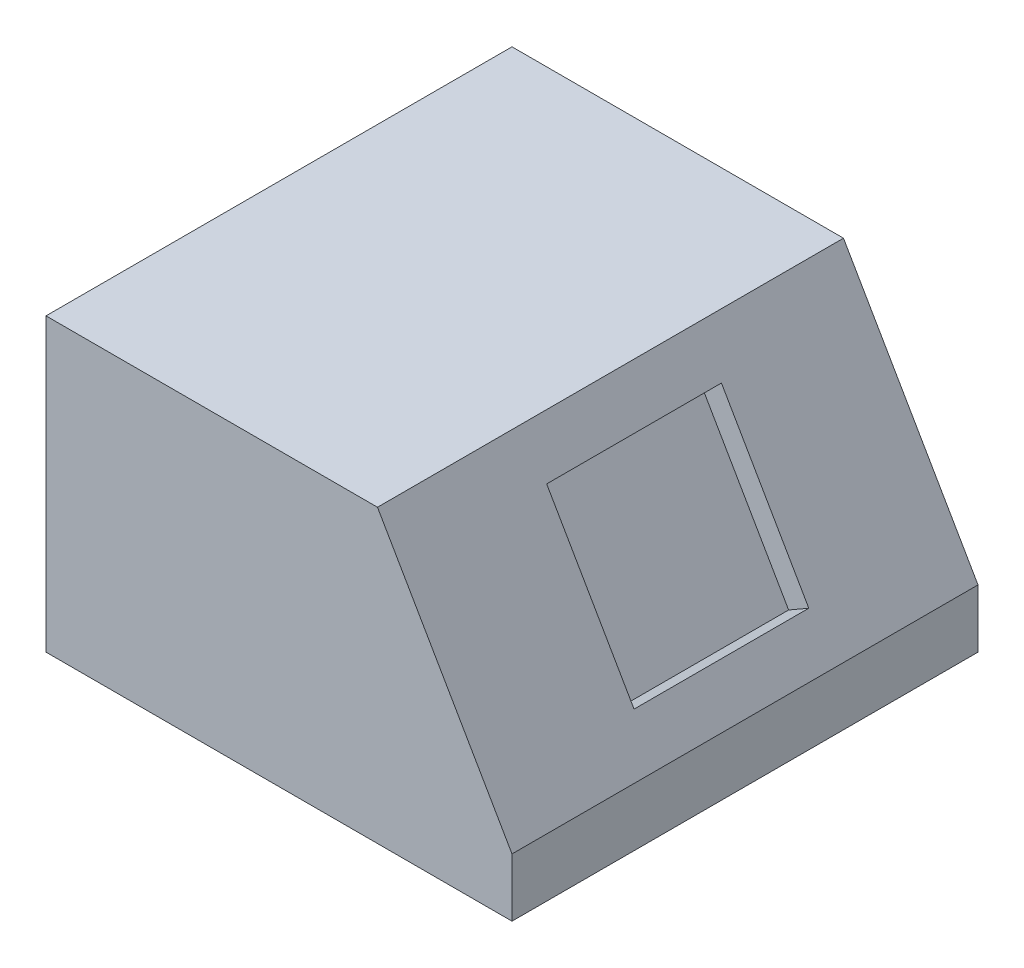
ISO-10303-21;
HEADER;
FILE_DESCRIPTION(('STEP AP214'),'2;1');
FILE_NAME('part.step','',(''),(''),'','','');
FILE_SCHEMA(('AUTOMOTIVE_DESIGN { 1 0 10303 214 1 1 1 1 }'));
ENDSEC;
DATA;
#1=APPLICATION_CONTEXT('core data for automotive mechanical design processes');
#2=APPLICATION_PROTOCOL_DEFINITION('international standard','automotive_design',2000,#1);
#3=PRODUCT_CONTEXT('',#1,'mechanical');
#4=PRODUCT('Part','Part','',(#3));
#5=PRODUCT_RELATED_PRODUCT_CATEGORY('part','',(#4));
#6=PRODUCT_DEFINITION_FORMATION('','',#4);
#7=PRODUCT_DEFINITION_CONTEXT('part definition',#1,'design');
#8=PRODUCT_DEFINITION('design','',#6,#7);
#9=PRODUCT_DEFINITION_SHAPE('','',#8);
#10=(LENGTH_UNIT() NAMED_UNIT(*) SI_UNIT(.MILLI.,.METRE.));
#11=(NAMED_UNIT(*) PLANE_ANGLE_UNIT() SI_UNIT($,.RADIAN.));
#12=(NAMED_UNIT(*) SI_UNIT($,.STERADIAN.) SOLID_ANGLE_UNIT());
#13=UNCERTAINTY_MEASURE_WITH_UNIT(LENGTH_MEASURE(1.E-05),#10,'distance_accuracy_value','');
#14=(GEOMETRIC_REPRESENTATION_CONTEXT(3) GLOBAL_UNCERTAINTY_ASSIGNED_CONTEXT((#13)) GLOBAL_UNIT_ASSIGNED_CONTEXT((#10,
#11,#12)) REPRESENTATION_CONTEXT('',''));
#15=CARTESIAN_POINT('',(0.,0.,0.));
#16=DIRECTION('',(0.,0.,1.));
#17=DIRECTION('',(1.,0.,0.));
#18=AXIS2_PLACEMENT_3D('',#15,#16,#17);
#19=CARTESIAN_POINT('',(-20.,25.,20.));
#20=DIRECTION('',(1.,0.,0.));
#21=DIRECTION('',(0.,0.,-1.));
#22=AXIS2_PLACEMENT_3D('',#19,#20,#21);
#23=PLANE('',#22);
#24=DIRECTION('',(0.,0.,1.));
#25=VECTOR('',#24,1.);
#26=CARTESIAN_POINT('',(-20.,0.,20.));
#27=LINE('',#26,#25);
#28=CARTESIAN_POINT('',(-20.,0.,-20.));
#29=VERTEX_POINT('',#28);
#30=CARTESIAN_POINT('',(-20.,0.,20.));
#31=VERTEX_POINT('',#30);
#32=EDGE_CURVE('E188',#29,#31,#27,.T.);
#33=ORIENTED_EDGE('',*,*,#32,.T.);
#34=DIRECTION('',(0.,-1.,0.));
#35=VECTOR('',#34,1.);
#36=CARTESIAN_POINT('',(-20.,25.,20.));
#37=LINE('',#36,#35);
#38=CARTESIAN_POINT('',(-20.,25.,20.));
#39=VERTEX_POINT('',#38);
#40=EDGE_CURVE('E232',#39,#31,#37,.T.);
#41=ORIENTED_EDGE('',*,*,#40,.F.);
#42=DIRECTION('',(0.,0.,1.));
#43=VECTOR('',#42,1.);
#44=CARTESIAN_POINT('',(-20.,25.,20.));
#45=LINE('',#44,#43);
#46=CARTESIAN_POINT('',(-20.,25.,-20.));
#47=VERTEX_POINT('',#46);
#48=EDGE_CURVE('E196',#47,#39,#45,.T.);
#49=ORIENTED_EDGE('',*,*,#48,.F.);
#50=DIRECTION('',(0.,-1.,0.));
#51=VECTOR('',#50,1.);
#52=CARTESIAN_POINT('',(-20.,25.,-20.));
#53=LINE('',#52,#51);
#54=EDGE_CURVE('E209',#47,#29,#53,.T.);
#55=ORIENTED_EDGE('',*,*,#54,.T.);
#56=EDGE_LOOP('',(#33,#41,#49,#55));
#57=FACE_BOUND('',#56,.T.);
#58=ADVANCED_FACE('F57',(#57),#23,.F.);
#59=CARTESIAN_POINT('',(20.,25.,20.));
#60=DIRECTION('',(0.,0.,-1.));
#61=DIRECTION('',(-1.,0.,0.));
#62=AXIS2_PLACEMENT_3D('',#59,#60,#61);
#63=PLANE('',#62);
#64=DIRECTION('',(0.,-1.,0.));
#65=VECTOR('',#64,1.);
#66=CARTESIAN_POINT('',(20.,25.,20.));
#67=LINE('',#66,#65);
#68=CARTESIAN_POINT('',(20.,4.99999999999988,20.));
#69=VERTEX_POINT('',#68);
#70=CARTESIAN_POINT('',(20.,0.,20.));
#71=VERTEX_POINT('',#70);
#72=EDGE_CURVE('E229',#69,#71,#67,.T.);
#73=ORIENTED_EDGE('',*,*,#72,.F.);
#74=DIRECTION('',(-0.499999999999998,0.86602540378444,0.));
#75=VECTOR('',#74,1.);
#76=CARTESIAN_POINT('',(8.45299461620747,25.,20.));
#77=LINE('',#76,#75);
#78=CARTESIAN_POINT('',(8.45299461620747,25.,20.));
#79=VERTEX_POINT('',#78);
#80=EDGE_CURVE('E12',#69,#79,#77,.T.);
#81=ORIENTED_EDGE('',*,*,#80,.T.);
#82=DIRECTION('',(1.,0.,0.));
#83=VECTOR('',#82,1.);
#84=CARTESIAN_POINT('',(20.,25.,20.));
#85=LINE('',#84,#83);
#86=EDGE_CURVE('E205',#39,#79,#85,.T.);
#87=ORIENTED_EDGE('',*,*,#86,.F.);
#88=ORIENTED_EDGE('',*,*,#40,.T.);
#89=DIRECTION('',(1.,0.,0.));
#90=VECTOR('',#89,1.);
#91=CARTESIAN_POINT('',(20.,0.,20.));
#92=LINE('',#91,#90);
#93=EDGE_CURVE('E212',#31,#71,#92,.T.);
#94=ORIENTED_EDGE('',*,*,#93,.T.);
#95=EDGE_LOOP('',(#73,#81,#87,#88,#94));
#96=FACE_BOUND('',#95,.T.);
#97=ADVANCED_FACE('F257',(#96),#63,.F.);
#98=CARTESIAN_POINT('',(20.,25.,20.));
#99=DIRECTION('',(-1.,0.,0.));
#100=DIRECTION('',(0.,0.,1.));
#101=AXIS2_PLACEMENT_3D('',#98,#99,#100);
#102=PLANE('',#101);
#103=DIRECTION('',(0.,-1.,0.));
#104=VECTOR('',#103,1.);
#105=CARTESIAN_POINT('',(20.,25.,-20.));
#106=LINE('',#105,#104);
#107=CARTESIAN_POINT('',(20.,4.99999999999988,-20.));
#108=VERTEX_POINT('',#107);
#109=CARTESIAN_POINT('',(20.,0.,-20.));
#110=VERTEX_POINT('',#109);
#111=EDGE_CURVE('E230',#108,#110,#106,.T.);
#112=ORIENTED_EDGE('',*,*,#111,.F.);
#113=DIRECTION('',(0.,0.,1.));
#114=VECTOR('',#113,1.);
#115=CARTESIAN_POINT('',(20.,4.99999999999988,20.));
#116=LINE('',#115,#114);
#117=EDGE_CURVE('E68',#108,#69,#116,.T.);
#118=ORIENTED_EDGE('',*,*,#117,.T.);
#119=ORIENTED_EDGE('',*,*,#72,.T.);
#120=DIRECTION('',(0.,0.,-1.));
#121=VECTOR('',#120,1.);
#122=CARTESIAN_POINT('',(20.,0.,20.));
#123=LINE('',#122,#121);
#124=EDGE_CURVE('E217',#71,#110,#123,.T.);
#125=ORIENTED_EDGE('',*,*,#124,.T.);
#126=EDGE_LOOP('',(#112,#118,#119,#125));
#127=FACE_BOUND('',#126,.T.);
#128=ADVANCED_FACE('F275',(#127),#102,.F.);
#129=CARTESIAN_POINT('',(20.,25.,-20.));
#130=DIRECTION('',(0.,0.,1.));
#131=DIRECTION('',(1.,0.,0.));
#132=AXIS2_PLACEMENT_3D('',#129,#130,#131);
#133=PLANE('',#132);
#134=DIRECTION('',(-1.,0.,0.));
#135=VECTOR('',#134,1.);
#136=CARTESIAN_POINT('',(20.,25.,-20.));
#137=LINE('',#136,#135);
#138=CARTESIAN_POINT('',(8.45299461620747,25.,-20.));
#139=VERTEX_POINT('',#138);
#140=EDGE_CURVE('E210',#139,#47,#137,.T.);
#141=ORIENTED_EDGE('',*,*,#140,.F.);
#142=DIRECTION('',(0.499999999999998,-0.86602540378444,0.));
#143=VECTOR('',#142,1.);
#144=CARTESIAN_POINT('',(8.45299461620747,25.,-20.));
#145=LINE('',#144,#143);
#146=EDGE_CURVE('E241',#139,#108,#145,.T.);
#147=ORIENTED_EDGE('',*,*,#146,.T.);
#148=ORIENTED_EDGE('',*,*,#111,.T.);
#149=DIRECTION('',(-1.,0.,0.));
#150=VECTOR('',#149,1.);
#151=CARTESIAN_POINT('',(20.,0.,-20.));
#152=LINE('',#151,#150);
#153=EDGE_CURVE('E201',#110,#29,#152,.T.);
#154=ORIENTED_EDGE('',*,*,#153,.T.);
#155=ORIENTED_EDGE('',*,*,#54,.F.);
#156=EDGE_LOOP('',(#141,#147,#148,#154,#155));
#157=FACE_BOUND('',#156,.T.);
#158=ADVANCED_FACE('F273',(#157),#133,.F.);
#159=CARTESIAN_POINT('',(0.,25.,0.));
#160=DIRECTION('',(0.,1.,0.));
#161=DIRECTION('',(0.,0.,1.));
#162=AXIS2_PLACEMENT_3D('',#159,#160,#161);
#163=PLANE('',#162);
#164=ORIENTED_EDGE('',*,*,#86,.T.);
#165=DIRECTION('',(0.,0.,-1.));
#166=VECTOR('',#165,1.);
#167=CARTESIAN_POINT('',(8.45299461620747,25.,-20.));
#168=LINE('',#167,#166);
#169=EDGE_CURVE('E240',#79,#139,#168,.T.);
#170=ORIENTED_EDGE('',*,*,#169,.T.);
#171=ORIENTED_EDGE('',*,*,#140,.T.);
#172=ORIENTED_EDGE('',*,*,#48,.T.);
#173=EDGE_LOOP('',(#164,#170,#171,#172));
#174=FACE_BOUND('',#173,.T.);
#175=ADVANCED_FACE('F265',(#174),#163,.T.);
#176=CARTESIAN_POINT('',(0.,0.,0.));
#177=DIRECTION('',(0.,1.,0.));
#178=DIRECTION('',(0.,0.,1.));
#179=AXIS2_PLACEMENT_3D('',#176,#177,#178);
#180=PLANE('',#179);
#181=ORIENTED_EDGE('',*,*,#32,.F.);
#182=ORIENTED_EDGE('',*,*,#153,.F.);
#183=ORIENTED_EDGE('',*,*,#124,.F.);
#184=ORIENTED_EDGE('',*,*,#93,.F.);
#185=EDGE_LOOP('',(#181,#182,#183,#184));
#186=FACE_BOUND('',#185,.T.);
#187=ADVANCED_FACE('F258',(#186),#180,.F.);
#188=CARTESIAN_POINT('',(8.45299461620747,25.,0.));
#189=DIRECTION('',(0.86602540378444,0.499999999999998,0.));
#190=DIRECTION('',(0.,0.,1.));
#191=AXIS2_PLACEMENT_3D('',#188,#189,#190);
#192=PLANE('',#191);
#193=DIRECTION('',(0.499999999999998,-0.86602540378444,0.));
#194=VECTOR('',#193,1.);
#195=CARTESIAN_POINT('',(17.9764973081037,8.50480947161665,7.5));
#196=LINE('',#195,#194);
#197=CARTESIAN_POINT('',(10.4764973081037,21.4951905283832,7.5));
#198=VERTEX_POINT('',#197);
#199=CARTESIAN_POINT('',(17.9764973081037,8.50480947161664,7.5));
#200=VERTEX_POINT('',#199);
#201=EDGE_CURVE('E71',#198,#200,#196,.T.);
#202=ORIENTED_EDGE('',*,*,#201,.F.);
#203=DIRECTION('',(0.,0.,1.));
#204=VECTOR('',#203,1.);
#205=CARTESIAN_POINT('',(10.4764973081037,21.4951905283832,-7.5));
#206=LINE('',#205,#204);
#207=CARTESIAN_POINT('',(10.4764973081037,21.4951905283832,-7.5));
#208=VERTEX_POINT('',#207);
#209=EDGE_CURVE('E151',#208,#198,#206,.T.);
#210=ORIENTED_EDGE('',*,*,#209,.F.);
#211=DIRECTION('',(-0.499999999999998,0.86602540378444,0.));
#212=VECTOR('',#211,1.);
#213=CARTESIAN_POINT('',(17.9764973081037,8.50480947161665,-7.5));
#214=LINE('',#213,#212);
#215=CARTESIAN_POINT('',(17.9764973081037,8.50480947161665,-7.5));
#216=VERTEX_POINT('',#215);
#217=EDGE_CURVE('E154',#216,#208,#214,.T.);
#218=ORIENTED_EDGE('',*,*,#217,.F.);
#219=DIRECTION('',(0.,0.,-1.));
#220=VECTOR('',#219,1.);
#221=CARTESIAN_POINT('',(17.9764973081037,8.50480947161665,-7.5));
#222=LINE('',#221,#220);
#223=EDGE_CURVE('E178',#200,#216,#222,.T.);
#224=ORIENTED_EDGE('',*,*,#223,.F.);
#225=EDGE_LOOP('',(#202,#210,#218,#224));
#226=FACE_BOUND('',#225,.T.);
#227=ORIENTED_EDGE('',*,*,#80,.F.);
#228=ORIENTED_EDGE('',*,*,#117,.F.);
#229=ORIENTED_EDGE('',*,*,#146,.F.);
#230=ORIENTED_EDGE('',*,*,#169,.F.);
#231=EDGE_LOOP('',(#227,#228,#229,#230));
#232=FACE_BOUND('',#231,.T.);
#233=ADVANCED_FACE('F56',(#226,#232),#192,.T.);
#234=CARTESIAN_POINT('',(16.2444465005348,7.50480947161665,7.5));
#235=DIRECTION('',(0.,0.,1.));
#236=DIRECTION('',(1.,0.,0.));
#237=AXIS2_PLACEMENT_3D('',#234,#235,#236);
#238=PLANE('',#237);
#239=ORIENTED_EDGE('',*,*,#201,.T.);
#240=DIRECTION('',(0.86602540378444,0.499999999999998,0.));
#241=VECTOR('',#240,1.);
#242=CARTESIAN_POINT('',(16.2444465005348,7.50480947161665,7.5));
#243=LINE('',#242,#241);
#244=CARTESIAN_POINT('',(16.2444465005348,7.50480947161665,7.5));
#245=VERTEX_POINT('',#244);
#246=EDGE_CURVE('E127',#245,#200,#243,.T.);
#247=ORIENTED_EDGE('',*,*,#246,.F.);
#248=DIRECTION('',(0.499999999999998,-0.86602540378444,0.));
#249=VECTOR('',#248,1.);
#250=CARTESIAN_POINT('',(16.2444465005348,7.50480947161665,7.5));
#251=LINE('',#250,#249);
#252=CARTESIAN_POINT('',(8.74444650053487,20.4951905283832,7.5));
#253=VERTEX_POINT('',#252);
#254=EDGE_CURVE('E128',#253,#245,#251,.T.);
#255=ORIENTED_EDGE('',*,*,#254,.F.);
#256=DIRECTION('',(0.86602540378444,0.499999999999998,0.));
#257=VECTOR('',#256,1.);
#258=CARTESIAN_POINT('',(8.74444650053487,20.4951905283832,7.5));
#259=LINE('',#258,#257);
#260=EDGE_CURVE('E186',#253,#198,#259,.T.);
#261=ORIENTED_EDGE('',*,*,#260,.T.);
#262=EDGE_LOOP('',(#239,#247,#255,#261));
#263=FACE_BOUND('',#262,.T.);
#264=ADVANCED_FACE('F126',(#263),#238,.F.);
#265=CARTESIAN_POINT('',(8.74444650053487,20.4951905283832,-7.5));
#266=DIRECTION('',(-0.499999999999998,0.86602540378444,0.));
#267=DIRECTION('',(-0.86602540378444,-0.499999999999998,0.));
#268=AXIS2_PLACEMENT_3D('',#265,#266,#267);
#269=PLANE('',#268);
#270=ORIENTED_EDGE('',*,*,#209,.T.);
#271=ORIENTED_EDGE('',*,*,#260,.F.);
#272=DIRECTION('',(0.,0.,1.));
#273=VECTOR('',#272,1.);
#274=CARTESIAN_POINT('',(8.74444650053487,20.4951905283832,-7.5));
#275=LINE('',#274,#273);
#276=CARTESIAN_POINT('',(8.74444650053487,20.4951905283832,-7.5));
#277=VERTEX_POINT('',#276);
#278=EDGE_CURVE('E139',#277,#253,#275,.T.);
#279=ORIENTED_EDGE('',*,*,#278,.F.);
#280=DIRECTION('',(0.86602540378444,0.499999999999998,0.));
#281=VECTOR('',#280,1.);
#282=CARTESIAN_POINT('',(8.74444650053487,20.4951905283832,-7.5));
#283=LINE('',#282,#281);
#284=EDGE_CURVE('E189',#277,#208,#283,.T.);
#285=ORIENTED_EDGE('',*,*,#284,.T.);
#286=EDGE_LOOP('',(#270,#271,#279,#285));
#287=FACE_BOUND('',#286,.T.);
#288=ADVANCED_FACE('F248',(#287),#269,.F.);
#289=CARTESIAN_POINT('',(16.2444465005348,7.50480947161665,-7.5));
#290=DIRECTION('',(0.,0.,-1.));
#291=DIRECTION('',(-1.,0.,0.));
#292=AXIS2_PLACEMENT_3D('',#289,#290,#291);
#293=PLANE('',#292);
#294=ORIENTED_EDGE('',*,*,#217,.T.);
#295=ORIENTED_EDGE('',*,*,#284,.F.);
#296=DIRECTION('',(-0.499999999999998,0.86602540378444,0.));
#297=VECTOR('',#296,1.);
#298=CARTESIAN_POINT('',(16.2444465005348,7.50480947161665,-7.5));
#299=LINE('',#298,#297);
#300=CARTESIAN_POINT('',(16.2444465005348,7.50480947161665,-7.5));
#301=VERTEX_POINT('',#300);
#302=EDGE_CURVE('E148',#301,#277,#299,.T.);
#303=ORIENTED_EDGE('',*,*,#302,.F.);
#304=DIRECTION('',(0.86602540378444,0.499999999999998,0.));
#305=VECTOR('',#304,1.);
#306=CARTESIAN_POINT('',(16.2444465005348,7.50480947161665,-7.5));
#307=LINE('',#306,#305);
#308=EDGE_CURVE('E138',#301,#216,#307,.T.);
#309=ORIENTED_EDGE('',*,*,#308,.T.);
#310=EDGE_LOOP('',(#294,#295,#303,#309));
#311=FACE_BOUND('',#310,.T.);
#312=ADVANCED_FACE('F246',(#311),#293,.F.);
#313=CARTESIAN_POINT('',(16.2444465005348,7.50480947161665,-7.5));
#314=DIRECTION('',(0.499999999999998,-0.86602540378444,0.));
#315=DIRECTION('',(0.86602540378444,0.499999999999998,0.));
#316=AXIS2_PLACEMENT_3D('',#313,#314,#315);
#317=PLANE('',#316);
#318=ORIENTED_EDGE('',*,*,#223,.T.);
#319=ORIENTED_EDGE('',*,*,#308,.F.);
#320=DIRECTION('',(0.,0.,-1.));
#321=VECTOR('',#320,1.);
#322=CARTESIAN_POINT('',(16.2444465005348,7.50480947161665,-7.5));
#323=LINE('',#322,#321);
#324=EDGE_CURVE('E136',#245,#301,#323,.T.);
#325=ORIENTED_EDGE('',*,*,#324,.F.);
#326=ORIENTED_EDGE('',*,*,#246,.T.);
#327=EDGE_LOOP('',(#318,#319,#325,#326));
#328=FACE_BOUND('',#327,.T.);
#329=ADVANCED_FACE('F143',(#328),#317,.F.);
#330=CARTESIAN_POINT('',(15.4330127018922,8.91025403784433,0.));
#331=DIRECTION('',(0.86602540378444,0.499999999999998,0.));
#332=DIRECTION('',(-0.499999999999998,0.86602540378444,0.));
#333=AXIS2_PLACEMENT_3D('',#330,#331,#332);
#334=PLANE('',#333);
#335=ORIENTED_EDGE('',*,*,#254,.T.);
#336=ORIENTED_EDGE('',*,*,#324,.T.);
#337=ORIENTED_EDGE('',*,*,#302,.T.);
#338=ORIENTED_EDGE('',*,*,#278,.T.);
#339=EDGE_LOOP('',(#335,#336,#337,#338));
#340=FACE_BOUND('',#339,.T.);
#341=ADVANCED_FACE('F146',(#340),#334,.T.);
#342=CLOSED_SHELL('',(#58,#97,#128,#158,#175,#187,#233,#264,#288,#312,#329,#341));
#343=MANIFOLD_SOLID_BREP('B2',#342);
#344=ADVANCED_BREP_SHAPE_REPRESENTATION('',(#18,#343),#14);
#345=SHAPE_DEFINITION_REPRESENTATION(#9,#344);
ENDSEC;
END-ISO-10303-21;
